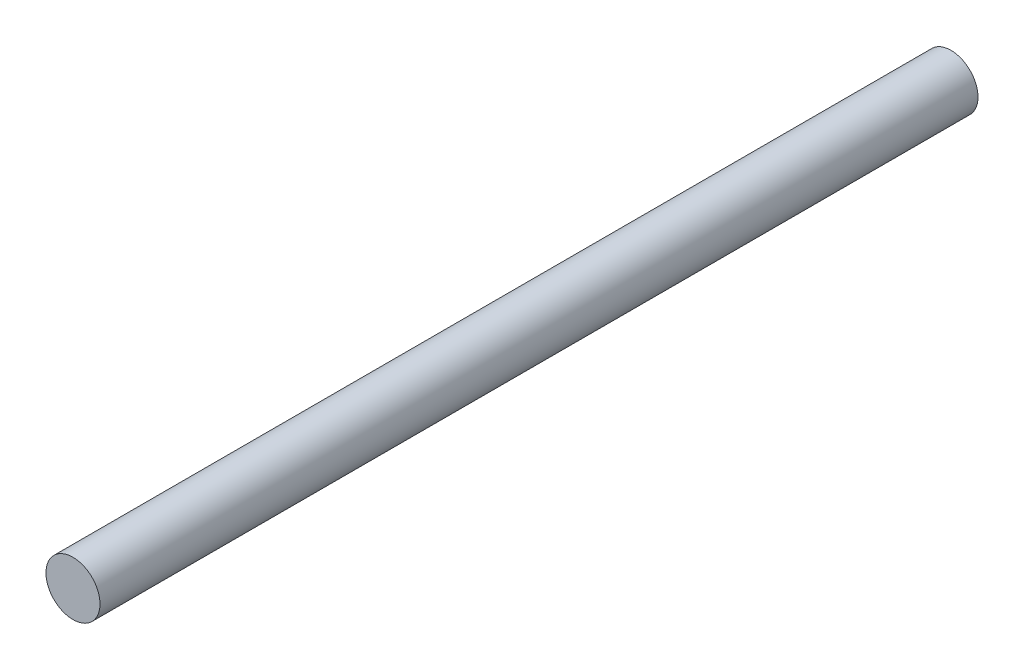
ISO-10303-21;
HEADER;
FILE_DESCRIPTION(('STEP AP214'),'2;1');
FILE_NAME('part.step','',(''),(''),'','','');
FILE_SCHEMA(('AUTOMOTIVE_DESIGN { 1 0 10303 214 1 1 1 1 }'));
ENDSEC;
DATA;
#1=APPLICATION_CONTEXT('core data for automotive mechanical design processes');
#2=APPLICATION_PROTOCOL_DEFINITION('international standard','automotive_design',2000,#1);
#3=PRODUCT_CONTEXT('',#1,'mechanical');
#4=PRODUCT('Part','Part','',(#3));
#5=PRODUCT_RELATED_PRODUCT_CATEGORY('part','',(#4));
#6=PRODUCT_DEFINITION_FORMATION('','',#4);
#7=PRODUCT_DEFINITION_CONTEXT('part definition',#1,'design');
#8=PRODUCT_DEFINITION('design','',#6,#7);
#9=PRODUCT_DEFINITION_SHAPE('','',#8);
#10=(LENGTH_UNIT() NAMED_UNIT(*) SI_UNIT(.MILLI.,.METRE.));
#11=(NAMED_UNIT(*) PLANE_ANGLE_UNIT() SI_UNIT($,.RADIAN.));
#12=(NAMED_UNIT(*) SI_UNIT($,.STERADIAN.) SOLID_ANGLE_UNIT());
#13=UNCERTAINTY_MEASURE_WITH_UNIT(LENGTH_MEASURE(1.E-05),#10,'distance_accuracy_value','');
#14=(GEOMETRIC_REPRESENTATION_CONTEXT(3) GLOBAL_UNCERTAINTY_ASSIGNED_CONTEXT((#13)) GLOBAL_UNIT_ASSIGNED_CONTEXT((#10,
#11,#12)) REPRESENTATION_CONTEXT('',''));
#15=CARTESIAN_POINT('',(0.,0.,0.));
#16=DIRECTION('',(0.,0.,1.));
#17=DIRECTION('',(1.,0.,0.));
#18=AXIS2_PLACEMENT_3D('',#15,#16,#17);
#19=CARTESIAN_POINT('',(0.,0.,65.));
#20=DIRECTION('',(0.,0.,-1.));
#21=DIRECTION('',(-1.,0.,0.));
#22=AXIS2_PLACEMENT_3D('',#19,#20,#21);
#23=CYLINDRICAL_SURFACE('',#22,2.);
#24=CARTESIAN_POINT('',(0.,0.,65.));
#25=DIRECTION('',(0.,0.,1.));
#26=DIRECTION('',(1.,0.,0.));
#27=AXIS2_PLACEMENT_3D('',#24,#25,#26);
#28=CIRCLE('',#27,2.);
#29=CARTESIAN_POINT('',(2.,0.,65.));
#30=VERTEX_POINT('',#29);
#31=EDGE_CURVE('E10',#30,#30,#28,.T.);
#32=ORIENTED_EDGE('',*,*,#31,.F.);
#33=EDGE_LOOP('',(#32));
#34=FACE_BOUND('',#33,.T.);
#35=CARTESIAN_POINT('',(0.,0.,0.));
#36=DIRECTION('',(0.,0.,1.));
#37=DIRECTION('',(1.,0.,0.));
#38=AXIS2_PLACEMENT_3D('',#35,#36,#37);
#39=CIRCLE('',#38,2.);
#40=CARTESIAN_POINT('',(2.,0.,0.));
#41=VERTEX_POINT('',#40);
#42=EDGE_CURVE('E42',#41,#41,#39,.T.);
#43=ORIENTED_EDGE('',*,*,#42,.T.);
#44=EDGE_LOOP('',(#43));
#45=FACE_BOUND('',#44,.T.);
#46=ADVANCED_FACE('F39',(#34,#45),#23,.T.);
#47=CARTESIAN_POINT('',(0.,0.,65.));
#48=DIRECTION('',(0.,0.,1.));
#49=DIRECTION('',(1.,0.,0.));
#50=AXIS2_PLACEMENT_3D('',#47,#48,#49);
#51=PLANE('',#50);
#52=ORIENTED_EDGE('',*,*,#31,.T.);
#53=EDGE_LOOP('',(#52));
#54=FACE_BOUND('',#53,.T.);
#55=ADVANCED_FACE('F54',(#54),#51,.T.);
#56=CARTESIAN_POINT('',(0.,0.,0.));
#57=DIRECTION('',(0.,0.,1.));
#58=DIRECTION('',(1.,0.,0.));
#59=AXIS2_PLACEMENT_3D('',#56,#57,#58);
#60=PLANE('',#59);
#61=ORIENTED_EDGE('',*,*,#42,.F.);
#62=EDGE_LOOP('',(#61));
#63=FACE_BOUND('',#62,.T.);
#64=ADVANCED_FACE('F52',(#63),#60,.F.);
#65=CLOSED_SHELL('',(#46,#55,#64));
#66=MANIFOLD_SOLID_BREP('B2',#65);
#67=ADVANCED_BREP_SHAPE_REPRESENTATION('',(#18,#66),#14);
#68=SHAPE_DEFINITION_REPRESENTATION(#9,#67);
ENDSEC;
END-ISO-10303-21;
